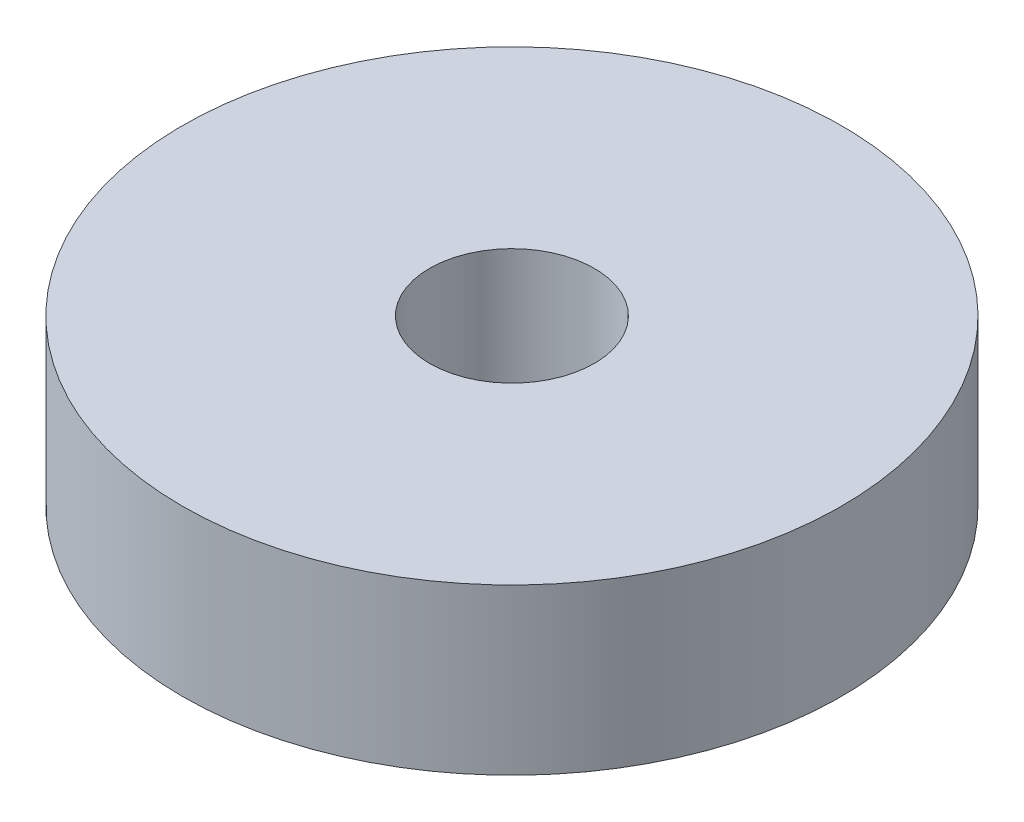
ISO-10303-21;
HEADER;
FILE_DESCRIPTION(('STEP AP214'),'2;1');
FILE_NAME('part.step','',(''),(''),'','','');
FILE_SCHEMA(('AUTOMOTIVE_DESIGN { 1 0 10303 214 1 1 1 1 }'));
ENDSEC;
DATA;
#1=APPLICATION_CONTEXT('core data for automotive mechanical design processes');
#2=APPLICATION_PROTOCOL_DEFINITION('international standard','automotive_design',2000,#1);
#3=PRODUCT_CONTEXT('',#1,'mechanical');
#4=PRODUCT('Part','Part','',(#3));
#5=PRODUCT_RELATED_PRODUCT_CATEGORY('part','',(#4));
#6=PRODUCT_DEFINITION_FORMATION('','',#4);
#7=PRODUCT_DEFINITION_CONTEXT('part definition',#1,'design');
#8=PRODUCT_DEFINITION('design','',#6,#7);
#9=PRODUCT_DEFINITION_SHAPE('','',#8);
#10=(LENGTH_UNIT() NAMED_UNIT(*) SI_UNIT(.MILLI.,.METRE.));
#11=(NAMED_UNIT(*) PLANE_ANGLE_UNIT() SI_UNIT($,.RADIAN.));
#12=(NAMED_UNIT(*) SI_UNIT($,.STERADIAN.) SOLID_ANGLE_UNIT());
#13=UNCERTAINTY_MEASURE_WITH_UNIT(LENGTH_MEASURE(1.E-05),#10,'distance_accuracy_value','');
#14=(GEOMETRIC_REPRESENTATION_CONTEXT(3) GLOBAL_UNCERTAINTY_ASSIGNED_CONTEXT((#13)) GLOBAL_UNIT_ASSIGNED_CONTEXT((#10,
#11,#12)) REPRESENTATION_CONTEXT('',''));
#15=CARTESIAN_POINT('',(0.,0.,0.));
#16=DIRECTION('',(0.,0.,1.));
#17=DIRECTION('',(1.,0.,0.));
#18=AXIS2_PLACEMENT_3D('',#15,#16,#17);
#19=CARTESIAN_POINT('',(0.,5.,0.));
#20=DIRECTION('',(0.,1.,0.));
#21=DIRECTION('',(0.,0.,1.));
#22=AXIS2_PLACEMENT_3D('',#19,#20,#21);
#23=PLANE('',#22);
#24=CARTESIAN_POINT('',(0.,5.,0.));
#25=DIRECTION('',(0.,1.,0.));
#26=DIRECTION('',(0.,0.,1.));
#27=AXIS2_PLACEMENT_3D('',#24,#25,#26);
#28=CIRCLE('',#27,10.);
#29=CARTESIAN_POINT('',(0.,5.,10.));
#30=VERTEX_POINT('',#29);
#31=EDGE_CURVE('E10',#30,#30,#28,.T.);
#32=ORIENTED_EDGE('',*,*,#31,.T.);
#33=EDGE_LOOP('',(#32));
#34=FACE_BOUND('',#33,.T.);
#35=CARTESIAN_POINT('',(0.,5.,0.));
#36=DIRECTION('',(0.,1.,0.));
#37=DIRECTION('',(0.,0.,1.));
#38=AXIS2_PLACEMENT_3D('',#35,#36,#37);
#39=CIRCLE('',#38,2.5);
#40=CARTESIAN_POINT('',(0.,5.,2.5));
#41=VERTEX_POINT('',#40);
#42=EDGE_CURVE('E54',#41,#41,#39,.T.);
#43=ORIENTED_EDGE('',*,*,#42,.F.);
#44=EDGE_LOOP('',(#43));
#45=FACE_BOUND('',#44,.T.);
#46=ADVANCED_FACE('F41',(#34,#45),#23,.T.);
#47=CARTESIAN_POINT('',(0.,0.,0.));
#48=DIRECTION('',(0.,1.,0.));
#49=DIRECTION('',(0.,0.,1.));
#50=AXIS2_PLACEMENT_3D('',#47,#48,#49);
#51=PLANE('',#50);
#52=CARTESIAN_POINT('',(0.,0.,0.));
#53=DIRECTION('',(0.,1.,0.));
#54=DIRECTION('',(0.,0.,1.));
#55=AXIS2_PLACEMENT_3D('',#52,#53,#54);
#56=CIRCLE('',#55,10.);
#57=CARTESIAN_POINT('',(0.,0.,10.));
#58=VERTEX_POINT('',#57);
#59=EDGE_CURVE('E45',#58,#58,#56,.T.);
#60=ORIENTED_EDGE('',*,*,#59,.F.);
#61=EDGE_LOOP('',(#60));
#62=FACE_BOUND('',#61,.T.);
#63=CARTESIAN_POINT('',(0.,0.,0.));
#64=DIRECTION('',(0.,1.,0.));
#65=DIRECTION('',(0.,0.,1.));
#66=AXIS2_PLACEMENT_3D('',#63,#64,#65);
#67=CIRCLE('',#66,2.5);
#68=CARTESIAN_POINT('',(0.,0.,2.5));
#69=VERTEX_POINT('',#68);
#70=EDGE_CURVE('E56',#69,#69,#67,.T.);
#71=ORIENTED_EDGE('',*,*,#70,.T.);
#72=EDGE_LOOP('',(#71));
#73=FACE_BOUND('',#72,.T.);
#74=ADVANCED_FACE('F68',(#62,#73),#51,.F.);
#75=CARTESIAN_POINT('',(0.,5.,0.));
#76=DIRECTION('',(0.,-1.,0.));
#77=DIRECTION('',(0.,0.,-1.));
#78=AXIS2_PLACEMENT_3D('',#75,#76,#77);
#79=CYLINDRICAL_SURFACE('',#78,10.);
#80=ORIENTED_EDGE('',*,*,#31,.F.);
#81=EDGE_LOOP('',(#80));
#82=FACE_BOUND('',#81,.T.);
#83=ORIENTED_EDGE('',*,*,#59,.T.);
#84=EDGE_LOOP('',(#83));
#85=FACE_BOUND('',#84,.T.);
#86=ADVANCED_FACE('F43',(#82,#85),#79,.T.);
#87=CARTESIAN_POINT('',(0.,5.,0.));
#88=DIRECTION('',(0.,-1.,0.));
#89=DIRECTION('',(0.,0.,-1.));
#90=AXIS2_PLACEMENT_3D('',#87,#88,#89);
#91=CYLINDRICAL_SURFACE('',#90,2.5);
#92=ORIENTED_EDGE('',*,*,#42,.T.);
#93=EDGE_LOOP('',(#92));
#94=FACE_BOUND('',#93,.T.);
#95=ORIENTED_EDGE('',*,*,#70,.F.);
#96=EDGE_LOOP('',(#95));
#97=FACE_BOUND('',#96,.T.);
#98=ADVANCED_FACE('F64',(#94,#97),#91,.F.);
#99=CLOSED_SHELL('',(#46,#74,#86,#98));
#100=MANIFOLD_SOLID_BREP('B2',#99);
#101=ADVANCED_BREP_SHAPE_REPRESENTATION('',(#18,#100),#14);
#102=SHAPE_DEFINITION_REPRESENTATION(#9,#101);
ENDSEC;
END-ISO-10303-21;
